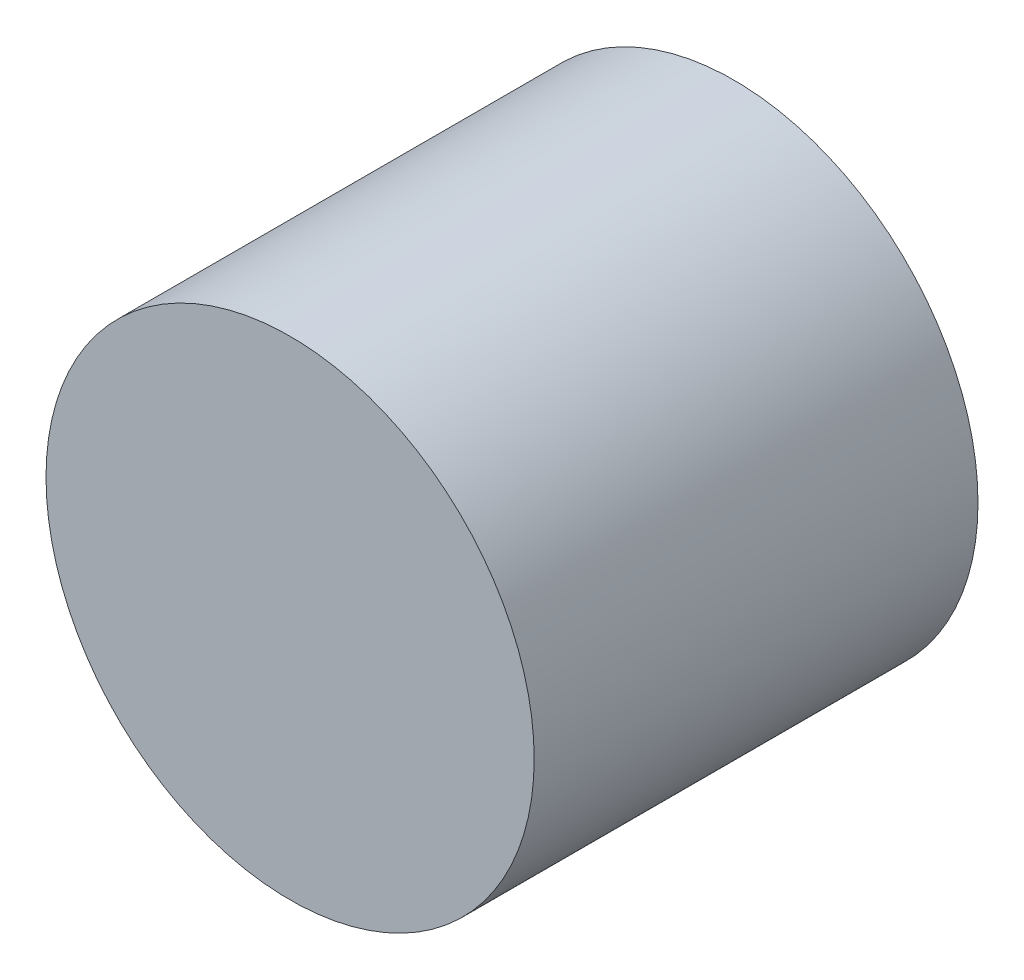
ISO-10303-21;
HEADER;
FILE_DESCRIPTION(('STEP AP214'),'2;1');
FILE_NAME('part.step','',(''),(''),'','','');
FILE_SCHEMA(('AUTOMOTIVE_DESIGN { 1 0 10303 214 1 1 1 1 }'));
ENDSEC;
DATA;
#1=APPLICATION_CONTEXT('core data for automotive mechanical design processes');
#2=APPLICATION_PROTOCOL_DEFINITION('international standard','automotive_design',2000,#1);
#3=PRODUCT_CONTEXT('',#1,'mechanical');
#4=PRODUCT('Part','Part','',(#3));
#5=PRODUCT_RELATED_PRODUCT_CATEGORY('part','',(#4));
#6=PRODUCT_DEFINITION_FORMATION('','',#4);
#7=PRODUCT_DEFINITION_CONTEXT('part definition',#1,'design');
#8=PRODUCT_DEFINITION('design','',#6,#7);
#9=PRODUCT_DEFINITION_SHAPE('','',#8);
#10=(LENGTH_UNIT() NAMED_UNIT(*) SI_UNIT(.MILLI.,.METRE.));
#11=(NAMED_UNIT(*) PLANE_ANGLE_UNIT() SI_UNIT($,.RADIAN.));
#12=(NAMED_UNIT(*) SI_UNIT($,.STERADIAN.) SOLID_ANGLE_UNIT());
#13=UNCERTAINTY_MEASURE_WITH_UNIT(LENGTH_MEASURE(1.E-05),#10,'distance_accuracy_value','');
#14=(GEOMETRIC_REPRESENTATION_CONTEXT(3) GLOBAL_UNCERTAINTY_ASSIGNED_CONTEXT((#13)) GLOBAL_UNIT_ASSIGNED_CONTEXT((#10,
#11,#12)) REPRESENTATION_CONTEXT('',''));
#15=CARTESIAN_POINT('',(0.,0.,0.));
#16=DIRECTION('',(0.,0.,1.));
#17=DIRECTION('',(1.,0.,0.));
#18=AXIS2_PLACEMENT_3D('',#15,#16,#17);
#19=CARTESIAN_POINT('',(0.,0.,400.));
#20=DIRECTION('',(0.,0.,-1.));
#21=DIRECTION('',(-1.,0.,0.));
#22=AXIS2_PLACEMENT_3D('',#19,#20,#21);
#23=CYLINDRICAL_SURFACE('',#22,220.);
#24=CARTESIAN_POINT('',(0.,0.,400.));
#25=DIRECTION('',(0.,0.,1.));
#26=DIRECTION('',(1.,0.,0.));
#27=AXIS2_PLACEMENT_3D('',#24,#25,#26);
#28=CIRCLE('',#27,220.);
#29=CARTESIAN_POINT('',(220.,0.,400.));
#30=VERTEX_POINT('',#29);
#31=EDGE_CURVE('E10',#30,#30,#28,.T.);
#32=ORIENTED_EDGE('',*,*,#31,.F.);
#33=EDGE_LOOP('',(#32));
#34=FACE_BOUND('',#33,.T.);
#35=CARTESIAN_POINT('',(0.,0.,0.));
#36=DIRECTION('',(0.,0.,1.));
#37=DIRECTION('',(1.,0.,0.));
#38=AXIS2_PLACEMENT_3D('',#35,#36,#37);
#39=CIRCLE('',#38,220.);
#40=CARTESIAN_POINT('',(220.,0.,0.));
#41=VERTEX_POINT('',#40);
#42=EDGE_CURVE('E45',#41,#41,#39,.T.);
#43=ORIENTED_EDGE('',*,*,#42,.T.);
#44=EDGE_LOOP('',(#43));
#45=FACE_BOUND('',#44,.T.);
#46=ADVANCED_FACE('F39',(#34,#45),#23,.T.);
#47=CARTESIAN_POINT('',(0.,0.,400.));
#48=DIRECTION('',(0.,0.,1.));
#49=DIRECTION('',(1.,0.,0.));
#50=AXIS2_PLACEMENT_3D('',#47,#48,#49);
#51=PLANE('',#50);
#52=ORIENTED_EDGE('',*,*,#31,.T.);
#53=EDGE_LOOP('',(#52));
#54=FACE_BOUND('',#53,.T.);
#55=ADVANCED_FACE('F53',(#54),#51,.T.);
#56=CARTESIAN_POINT('',(0.,0.,0.));
#57=DIRECTION('',(0.,0.,1.));
#58=DIRECTION('',(1.,0.,0.));
#59=AXIS2_PLACEMENT_3D('',#56,#57,#58);
#60=PLANE('',#59);
#61=ORIENTED_EDGE('',*,*,#42,.F.);
#62=EDGE_LOOP('',(#61));
#63=FACE_BOUND('',#62,.T.);
#64=ADVANCED_FACE('F55',(#63),#60,.F.);
#65=CLOSED_SHELL('',(#46,#55,#64));
#66=MANIFOLD_SOLID_BREP('B2',#65);
#67=ADVANCED_BREP_SHAPE_REPRESENTATION('',(#18,#66),#14);
#68=SHAPE_DEFINITION_REPRESENTATION(#9,#67);
ENDSEC;
END-ISO-10303-21;
